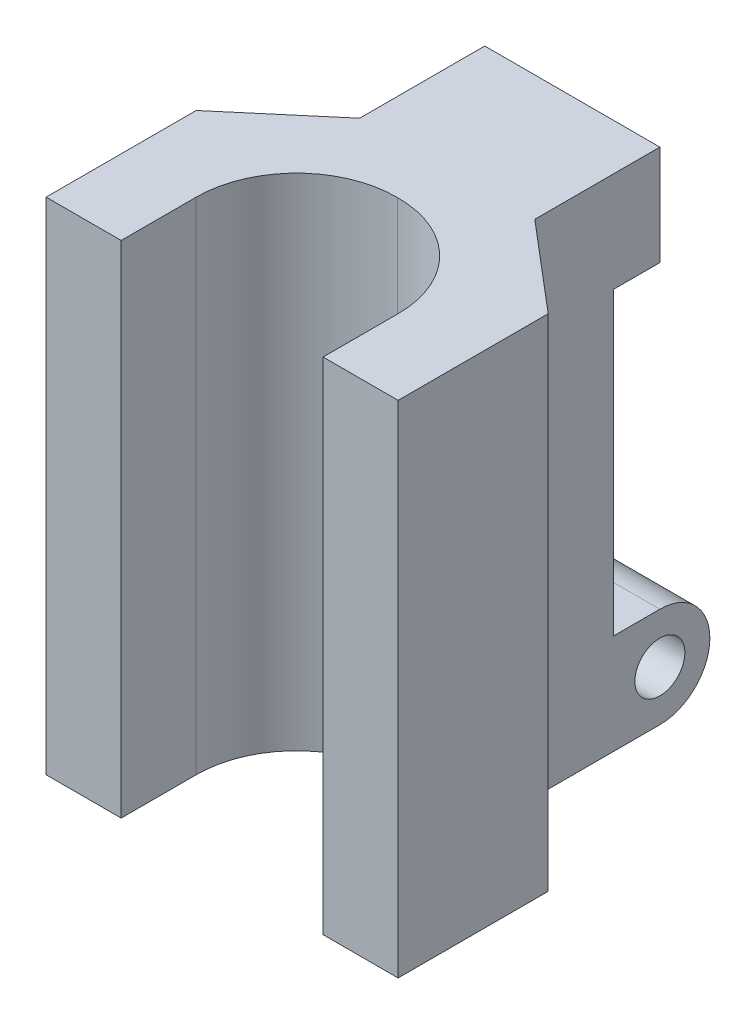
ISO-10303-21;
HEADER;
FILE_DESCRIPTION(('STEP AP214'),'2;1');
FILE_NAME('part.step','',(''),(''),'','','');
FILE_SCHEMA(('AUTOMOTIVE_DESIGN { 1 0 10303 214 1 1 1 1 }'));
ENDSEC;
DATA;
#1=APPLICATION_CONTEXT('core data for automotive mechanical design processes');
#2=APPLICATION_PROTOCOL_DEFINITION('international standard','automotive_design',2000,#1);
#3=PRODUCT_CONTEXT('',#1,'mechanical');
#4=PRODUCT('Part','Part','',(#3));
#5=PRODUCT_RELATED_PRODUCT_CATEGORY('part','',(#4));
#6=PRODUCT_DEFINITION_FORMATION('','',#4);
#7=PRODUCT_DEFINITION_CONTEXT('part definition',#1,'design');
#8=PRODUCT_DEFINITION('design','',#6,#7);
#9=PRODUCT_DEFINITION_SHAPE('','',#8);
#10=(LENGTH_UNIT() NAMED_UNIT(*) SI_UNIT(.MILLI.,.METRE.));
#11=(NAMED_UNIT(*) PLANE_ANGLE_UNIT() SI_UNIT($,.RADIAN.));
#12=(NAMED_UNIT(*) SI_UNIT($,.STERADIAN.) SOLID_ANGLE_UNIT());
#13=UNCERTAINTY_MEASURE_WITH_UNIT(LENGTH_MEASURE(1.E-05),#10,'distance_accuracy_value','');
#14=(GEOMETRIC_REPRESENTATION_CONTEXT(3) GLOBAL_UNCERTAINTY_ASSIGNED_CONTEXT((#13)) GLOBAL_UNIT_ASSIGNED_CONTEXT((#10,
#11,#12)) REPRESENTATION_CONTEXT('',''));
#15=CARTESIAN_POINT('',(0.,0.,0.));
#16=DIRECTION('',(0.,0.,1.));
#17=DIRECTION('',(1.,0.,0.));
#18=AXIS2_PLACEMENT_3D('',#15,#16,#17);
#19=CARTESIAN_POINT('',(0.,0.,0.));
#20=DIRECTION('',(0.,1.,0.));
#21=DIRECTION('',(0.,0.,1.));
#22=AXIS2_PLACEMENT_3D('',#19,#20,#21);
#23=PLANE('',#22);
#24=CARTESIAN_POINT('',(0.226816500569542,0.,38.0561546430867));
#25=DIRECTION('',(0.,1.,0.));
#26=DIRECTION('',(0.,0.,1.));
#27=AXIS2_PLACEMENT_3D('',#24,#25,#26);
#28=CIRCLE('',#27,25.4);
#29=CARTESIAN_POINT('',(25.62677865772,0.,38.1));
#30=VERTEX_POINT('',#29);
#31=CARTESIAN_POINT('',(0.,0.,12.6571673743969));
#32=VERTEX_POINT('',#31);
#33=EDGE_CURVE('E221',#30,#32,#28,.T.);
#34=ORIENTED_EDGE('',*,*,#33,.F.);
#35=DIRECTION('',(0.,0.,-1.));
#36=VECTOR('',#35,1.);
#37=CARTESIAN_POINT('',(25.62677865772,0.,0.));
#38=LINE('',#37,#36);
#39=CARTESIAN_POINT('',(25.62677865772,0.,57.15));
#40=VERTEX_POINT('',#39);
#41=EDGE_CURVE('E223',#40,#30,#38,.T.);
#42=ORIENTED_EDGE('',*,*,#41,.F.);
#43=DIRECTION('',(-1.,0.,0.));
#44=VECTOR('',#43,1.);
#45=CARTESIAN_POINT('',(0.,0.,57.15));
#46=LINE('',#45,#44);
#47=CARTESIAN_POINT('',(44.67677865772,0.,57.15));
#48=VERTEX_POINT('',#47);
#49=EDGE_CURVE('E226',#48,#40,#46,.T.);
#50=ORIENTED_EDGE('',*,*,#49,.F.);
#51=DIRECTION('',(0.,0.,1.));
#52=VECTOR('',#51,1.);
#53=CARTESIAN_POINT('',(44.67677865772,0.,0.));
#54=LINE('',#53,#52);
#55=CARTESIAN_POINT('',(44.67677865772,0.,19.05));
#56=VERTEX_POINT('',#55);
#57=EDGE_CURVE('E228',#56,#48,#54,.T.);
#58=ORIENTED_EDGE('',*,*,#57,.F.);
#59=DIRECTION('',(0.762509035057774,0.,0.646977566423491));
#60=VECTOR('',#59,1.);
#61=CARTESIAN_POINT('',(9.30293986559321,0.,-10.9641756812797));
#62=LINE('',#61,#60);
#63=CARTESIAN_POINT('',(22.225,0.,0.));
#64=VERTEX_POINT('',#63);
#65=EDGE_CURVE('E230',#64,#56,#62,.T.);
#66=ORIENTED_EDGE('',*,*,#65,.F.);
#67=DIRECTION('',(0.,0.,-1.));
#68=VECTOR('',#67,1.);
#69=CARTESIAN_POINT('',(22.225,0.,-31.75));
#70=LINE('',#69,#68);
#71=CARTESIAN_POINT('',(22.225,0.,-31.75));
#72=VERTEX_POINT('',#71);
#73=EDGE_CURVE('E332',#64,#72,#70,.T.);
#74=ORIENTED_EDGE('',*,*,#73,.T.);
#75=DIRECTION('',(-1.,0.,0.));
#76=VECTOR('',#75,1.);
#77=CARTESIAN_POINT('',(22.225,0.,-31.75));
#78=LINE('',#77,#76);
#79=CARTESIAN_POINT('',(-22.225,0.,-31.75));
#80=VERTEX_POINT('',#79);
#81=EDGE_CURVE('E354',#72,#80,#78,.T.);
#82=ORIENTED_EDGE('',*,*,#81,.T.);
#83=DIRECTION('',(0.,0.,-1.));
#84=VECTOR('',#83,1.);
#85=CARTESIAN_POINT('',(-22.225,0.,-31.75));
#86=LINE('',#85,#84);
#87=CARTESIAN_POINT('',(-22.225,0.,0.));
#88=VERTEX_POINT('',#87);
#89=EDGE_CURVE('E329',#88,#80,#86,.T.);
#90=ORIENTED_EDGE('',*,*,#89,.F.);
#91=DIRECTION('',(-0.762509035057774,0.,0.646977566423491));
#92=VECTOR('',#91,1.);
#93=CARTESIAN_POINT('',(-9.30293986559322,0.,-10.9641756812797));
#94=LINE('',#93,#92);
#95=CARTESIAN_POINT('',(-44.67677865772,0.,19.05));
#96=VERTEX_POINT('',#95);
#97=EDGE_CURVE('E232',#88,#96,#94,.T.);
#98=ORIENTED_EDGE('',*,*,#97,.T.);
#99=DIRECTION('',(0.,0.,1.));
#100=VECTOR('',#99,1.);
#101=CARTESIAN_POINT('',(-44.67677865772,0.,0.));
#102=LINE('',#101,#100);
#103=CARTESIAN_POINT('',(-44.67677865772,0.,57.15));
#104=VERTEX_POINT('',#103);
#105=EDGE_CURVE('E235',#96,#104,#102,.T.);
#106=ORIENTED_EDGE('',*,*,#105,.T.);
#107=DIRECTION('',(1.,0.,0.));
#108=VECTOR('',#107,1.);
#109=CARTESIAN_POINT('',(0.,0.,57.15));
#110=LINE('',#109,#108);
#111=CARTESIAN_POINT('',(-25.62677865772,0.,57.15));
#112=VERTEX_POINT('',#111);
#113=EDGE_CURVE('E238',#104,#112,#110,.T.);
#114=ORIENTED_EDGE('',*,*,#113,.T.);
#115=DIRECTION('',(0.,0.,-1.));
#116=VECTOR('',#115,1.);
#117=CARTESIAN_POINT('',(-25.62677865772,0.,0.));
#118=LINE('',#117,#116);
#119=CARTESIAN_POINT('',(-25.62677865772,0.,38.1));
#120=VERTEX_POINT('',#119);
#121=EDGE_CURVE('E199',#112,#120,#118,.T.);
#122=ORIENTED_EDGE('',*,*,#121,.T.);
#123=CARTESIAN_POINT('',(-0.226816500569542,0.,38.0561546430867));
#124=DIRECTION('',(0.,1.,0.));
#125=DIRECTION('',(0.,0.,1.));
#126=AXIS2_PLACEMENT_3D('',#123,#124,#125);
#127=CIRCLE('',#126,25.4);
#128=EDGE_CURVE('E241',#120,#32,#127,.F.);
#129=ORIENTED_EDGE('',*,*,#128,.T.);
#130=EDGE_LOOP('',(#34,#42,#50,#58,#66,#74,#82,#90,#98,#106,#114,#122,#129));
#131=FACE_BOUND('',#130,.T.);
#132=ADVANCED_FACE('F105',(#131),#23,.T.);
#133=CARTESIAN_POINT('',(0.226816500569542,-127.,38.0561546430867));
#134=DIRECTION('',(0.,1.,0.));
#135=DIRECTION('',(0.,0.,1.));
#136=AXIS2_PLACEMENT_3D('',#133,#134,#135);
#137=CYLINDRICAL_SURFACE('',#136,25.4);
#138=ORIENTED_EDGE('',*,*,#33,.T.);
#139=DIRECTION('',(0.,1.,0.));
#140=VECTOR('',#139,1.);
#141=CARTESIAN_POINT('',(0.,-127.,12.6571673743969));
#142=LINE('',#141,#140);
#143=CARTESIAN_POINT('',(0.,-127.,12.6571673743969));
#144=VERTEX_POINT('',#143);
#145=EDGE_CURVE('E12',#144,#32,#142,.T.);
#146=ORIENTED_EDGE('',*,*,#145,.F.);
#147=CARTESIAN_POINT('',(0.226816500569542,-127.,38.0561546430867));
#148=DIRECTION('',(0.,1.,0.));
#149=DIRECTION('',(0.,0.,1.));
#150=AXIS2_PLACEMENT_3D('',#147,#148,#149);
#151=CIRCLE('',#150,25.4);
#152=CARTESIAN_POINT('',(25.62677865772,-127.,38.1));
#153=VERTEX_POINT('',#152);
#154=EDGE_CURVE('E124',#153,#144,#151,.T.);
#155=ORIENTED_EDGE('',*,*,#154,.F.);
#156=DIRECTION('',(0.,1.,0.));
#157=VECTOR('',#156,1.);
#158=CARTESIAN_POINT('',(25.62677865772,-127.,38.1));
#159=LINE('',#158,#157);
#160=EDGE_CURVE('E109',#153,#30,#159,.T.);
#161=ORIENTED_EDGE('',*,*,#160,.T.);
#162=EDGE_LOOP('',(#138,#146,#155,#161));
#163=FACE_BOUND('',#162,.T.);
#164=ADVANCED_FACE('F107',(#163),#137,.F.);
#165=CARTESIAN_POINT('',(25.62677865772,-127.,0.));
#166=DIRECTION('',(1.,0.,0.));
#167=DIRECTION('',(0.,0.,-1.));
#168=AXIS2_PLACEMENT_3D('',#165,#166,#167);
#169=PLANE('',#168);
#170=ORIENTED_EDGE('',*,*,#41,.T.);
#171=ORIENTED_EDGE('',*,*,#160,.F.);
#172=DIRECTION('',(0.,0.,-1.));
#173=VECTOR('',#172,1.);
#174=CARTESIAN_POINT('',(25.62677865772,-127.,0.));
#175=LINE('',#174,#173);
#176=CARTESIAN_POINT('',(25.62677865772,-127.,57.15));
#177=VERTEX_POINT('',#176);
#178=EDGE_CURVE('E170',#177,#153,#175,.T.);
#179=ORIENTED_EDGE('',*,*,#178,.F.);
#180=DIRECTION('',(0.,1.,0.));
#181=VECTOR('',#180,1.);
#182=CARTESIAN_POINT('',(25.62677865772,-127.,57.15));
#183=LINE('',#182,#181);
#184=EDGE_CURVE('E258',#177,#40,#183,.T.);
#185=ORIENTED_EDGE('',*,*,#184,.T.);
#186=EDGE_LOOP('',(#170,#171,#179,#185));
#187=FACE_BOUND('',#186,.T.);
#188=ADVANCED_FACE('F280',(#187),#169,.F.);
#189=CARTESIAN_POINT('',(0.,-127.,57.15));
#190=DIRECTION('',(0.,0.,-1.));
#191=DIRECTION('',(-1.,0.,0.));
#192=AXIS2_PLACEMENT_3D('',#189,#190,#191);
#193=PLANE('',#192);
#194=ORIENTED_EDGE('',*,*,#49,.T.);
#195=ORIENTED_EDGE('',*,*,#184,.F.);
#196=DIRECTION('',(-1.,0.,0.));
#197=VECTOR('',#196,1.);
#198=CARTESIAN_POINT('',(0.,-127.,57.15));
#199=LINE('',#198,#197);
#200=CARTESIAN_POINT('',(44.67677865772,-127.,57.15));
#201=VERTEX_POINT('',#200);
#202=EDGE_CURVE('E392',#201,#177,#199,.T.);
#203=ORIENTED_EDGE('',*,*,#202,.F.);
#204=DIRECTION('',(0.,1.,0.));
#205=VECTOR('',#204,1.);
#206=CARTESIAN_POINT('',(44.67677865772,-127.,57.15));
#207=LINE('',#206,#205);
#208=EDGE_CURVE('E256',#201,#48,#207,.T.);
#209=ORIENTED_EDGE('',*,*,#208,.T.);
#210=EDGE_LOOP('',(#194,#195,#203,#209));
#211=FACE_BOUND('',#210,.T.);
#212=ADVANCED_FACE('F285',(#211),#193,.F.);
#213=CARTESIAN_POINT('',(44.67677865772,-127.,0.));
#214=DIRECTION('',(-1.,0.,0.));
#215=DIRECTION('',(0.,0.,1.));
#216=AXIS2_PLACEMENT_3D('',#213,#214,#215);
#217=PLANE('',#216);
#218=ORIENTED_EDGE('',*,*,#57,.T.);
#219=ORIENTED_EDGE('',*,*,#208,.F.);
#220=DIRECTION('',(0.,0.,1.));
#221=VECTOR('',#220,1.);
#222=CARTESIAN_POINT('',(44.67677865772,-127.,0.));
#223=LINE('',#222,#221);
#224=CARTESIAN_POINT('',(44.67677865772,-127.,19.05));
#225=VERTEX_POINT('',#224);
#226=EDGE_CURVE('E394',#225,#201,#223,.T.);
#227=ORIENTED_EDGE('',*,*,#226,.F.);
#228=DIRECTION('',(0.,1.,0.));
#229=VECTOR('',#228,1.);
#230=CARTESIAN_POINT('',(44.67677865772,-127.,19.05));
#231=LINE('',#230,#229);
#232=EDGE_CURVE('E253',#225,#56,#231,.T.);
#233=ORIENTED_EDGE('',*,*,#232,.T.);
#234=EDGE_LOOP('',(#218,#219,#227,#233));
#235=FACE_BOUND('',#234,.T.);
#236=ADVANCED_FACE('F451',(#235),#217,.F.);
#237=CARTESIAN_POINT('',(9.30293986559321,-127.,-10.9641756812797));
#238=DIRECTION('',(-0.646977566423491,0.,0.762509035057774));
#239=DIRECTION('',(0.762509035057774,0.,0.646977566423491));
#240=AXIS2_PLACEMENT_3D('',#237,#238,#239);
#241=PLANE('',#240);
#242=ORIENTED_EDGE('',*,*,#65,.T.);
#243=ORIENTED_EDGE('',*,*,#232,.F.);
#244=DIRECTION('',(0.762509035057774,0.,0.646977566423491));
#245=VECTOR('',#244,1.);
#246=CARTESIAN_POINT('',(9.30293986559321,-127.,-10.9641756812797));
#247=LINE('',#246,#245);
#248=CARTESIAN_POINT('',(22.225,-127.,0.));
#249=VERTEX_POINT('',#248);
#250=EDGE_CURVE('E396',#249,#225,#247,.T.);
#251=ORIENTED_EDGE('',*,*,#250,.F.);
#252=DIRECTION('',(0.,1.,0.));
#253=VECTOR('',#252,1.);
#254=CARTESIAN_POINT('',(22.225,-127.,0.));
#255=LINE('',#254,#253);
#256=EDGE_CURVE('E251',#249,#64,#255,.T.);
#257=ORIENTED_EDGE('',*,*,#256,.T.);
#258=EDGE_LOOP('',(#242,#243,#251,#257));
#259=FACE_BOUND('',#258,.T.);
#260=ADVANCED_FACE('F448',(#259),#241,.F.);
#261=CARTESIAN_POINT('',(-9.30293986559322,-127.,-10.9641756812797));
#262=DIRECTION('',(-0.646977566423491,0.,-0.762509035057774));
#263=DIRECTION('',(-0.762509035057774,0.,0.646977566423491));
#264=AXIS2_PLACEMENT_3D('',#261,#262,#263);
#265=PLANE('',#264);
#266=ORIENTED_EDGE('',*,*,#97,.F.);
#267=DIRECTION('',(0.,1.,0.));
#268=VECTOR('',#267,1.);
#269=CARTESIAN_POINT('',(-22.225,-127.,0.));
#270=LINE('',#269,#268);
#271=CARTESIAN_POINT('',(-22.225,-127.,0.));
#272=VERTEX_POINT('',#271);
#273=EDGE_CURVE('E248',#272,#88,#270,.T.);
#274=ORIENTED_EDGE('',*,*,#273,.F.);
#275=DIRECTION('',(-0.762509035057774,0.,0.646977566423491));
#276=VECTOR('',#275,1.);
#277=CARTESIAN_POINT('',(-9.30293986559322,-127.,-10.9641756812797));
#278=LINE('',#277,#276);
#279=CARTESIAN_POINT('',(-44.67677865772,-127.,19.05));
#280=VERTEX_POINT('',#279);
#281=EDGE_CURVE('E216',#272,#280,#278,.T.);
#282=ORIENTED_EDGE('',*,*,#281,.T.);
#283=DIRECTION('',(0.,1.,0.));
#284=VECTOR('',#283,1.);
#285=CARTESIAN_POINT('',(-44.67677865772,-127.,19.05));
#286=LINE('',#285,#284);
#287=EDGE_CURVE('E246',#280,#96,#286,.T.);
#288=ORIENTED_EDGE('',*,*,#287,.T.);
#289=EDGE_LOOP('',(#266,#274,#282,#288));
#290=FACE_BOUND('',#289,.T.);
#291=ADVANCED_FACE('F401',(#290),#265,.T.);
#292=CARTESIAN_POINT('',(-44.67677865772,-127.,0.));
#293=DIRECTION('',(-1.,0.,0.));
#294=DIRECTION('',(0.,0.,1.));
#295=AXIS2_PLACEMENT_3D('',#292,#293,#294);
#296=PLANE('',#295);
#297=ORIENTED_EDGE('',*,*,#105,.F.);
#298=ORIENTED_EDGE('',*,*,#287,.F.);
#299=DIRECTION('',(0.,0.,1.));
#300=VECTOR('',#299,1.);
#301=CARTESIAN_POINT('',(-44.67677865772,-127.,0.));
#302=LINE('',#301,#300);
#303=CARTESIAN_POINT('',(-44.67677865772,-127.,57.15));
#304=VERTEX_POINT('',#303);
#305=EDGE_CURVE('E214',#280,#304,#302,.T.);
#306=ORIENTED_EDGE('',*,*,#305,.T.);
#307=DIRECTION('',(0.,1.,0.));
#308=VECTOR('',#307,1.);
#309=CARTESIAN_POINT('',(-44.67677865772,-127.,57.15));
#310=LINE('',#309,#308);
#311=EDGE_CURVE('E204',#304,#104,#310,.T.);
#312=ORIENTED_EDGE('',*,*,#311,.T.);
#313=EDGE_LOOP('',(#297,#298,#306,#312));
#314=FACE_BOUND('',#313,.T.);
#315=ADVANCED_FACE('F459',(#314),#296,.T.);
#316=CARTESIAN_POINT('',(0.,-127.,57.15));
#317=DIRECTION('',(0.,0.,1.));
#318=DIRECTION('',(1.,0.,0.));
#319=AXIS2_PLACEMENT_3D('',#316,#317,#318);
#320=PLANE('',#319);
#321=ORIENTED_EDGE('',*,*,#113,.F.);
#322=ORIENTED_EDGE('',*,*,#311,.F.);
#323=DIRECTION('',(1.,0.,0.));
#324=VECTOR('',#323,1.);
#325=CARTESIAN_POINT('',(0.,-127.,57.15));
#326=LINE('',#325,#324);
#327=CARTESIAN_POINT('',(-25.62677865772,-127.,57.15));
#328=VERTEX_POINT('',#327);
#329=EDGE_CURVE('E209',#304,#328,#326,.T.);
#330=ORIENTED_EDGE('',*,*,#329,.T.);
#331=DIRECTION('',(0.,1.,0.));
#332=VECTOR('',#331,1.);
#333=CARTESIAN_POINT('',(-25.62677865772,-127.,57.15));
#334=LINE('',#333,#332);
#335=EDGE_CURVE('E195',#328,#112,#334,.T.);
#336=ORIENTED_EDGE('',*,*,#335,.T.);
#337=EDGE_LOOP('',(#321,#322,#330,#336));
#338=FACE_BOUND('',#337,.T.);
#339=ADVANCED_FACE('F213',(#338),#320,.T.);
#340=CARTESIAN_POINT('',(-25.62677865772,-127.,0.));
#341=DIRECTION('',(1.,0.,0.));
#342=DIRECTION('',(0.,0.,-1.));
#343=AXIS2_PLACEMENT_3D('',#340,#341,#342);
#344=PLANE('',#343);
#345=ORIENTED_EDGE('',*,*,#121,.F.);
#346=ORIENTED_EDGE('',*,*,#335,.F.);
#347=DIRECTION('',(0.,0.,-1.));
#348=VECTOR('',#347,1.);
#349=CARTESIAN_POINT('',(-25.62677865772,-127.,0.));
#350=LINE('',#349,#348);
#351=CARTESIAN_POINT('',(-25.62677865772,-127.,38.1));
#352=VERTEX_POINT('',#351);
#353=EDGE_CURVE('E198',#328,#352,#350,.T.);
#354=ORIENTED_EDGE('',*,*,#353,.T.);
#355=DIRECTION('',(0.,1.,0.));
#356=VECTOR('',#355,1.);
#357=CARTESIAN_POINT('',(-25.62677865772,-127.,38.1));
#358=LINE('',#357,#356);
#359=EDGE_CURVE('E115',#352,#120,#358,.T.);
#360=ORIENTED_EDGE('',*,*,#359,.T.);
#361=EDGE_LOOP('',(#345,#346,#354,#360));
#362=FACE_BOUND('',#361,.T.);
#363=ADVANCED_FACE('F197',(#362),#344,.T.);
#364=CARTESIAN_POINT('',(-0.226816500569542,-127.,38.0561546430867));
#365=DIRECTION('',(0.,1.,0.));
#366=DIRECTION('',(0.,0.,1.));
#367=AXIS2_PLACEMENT_3D('',#364,#365,#366);
#368=CYLINDRICAL_SURFACE('',#367,25.4);
#369=ORIENTED_EDGE('',*,*,#128,.F.);
#370=ORIENTED_EDGE('',*,*,#359,.F.);
#371=CARTESIAN_POINT('',(-0.226816500569542,-127.,38.0561546430867));
#372=DIRECTION('',(0.,1.,0.));
#373=DIRECTION('',(0.,0.,1.));
#374=AXIS2_PLACEMENT_3D('',#371,#372,#373);
#375=CIRCLE('',#374,25.4);
#376=EDGE_CURVE('E211',#352,#144,#375,.F.);
#377=ORIENTED_EDGE('',*,*,#376,.T.);
#378=ORIENTED_EDGE('',*,*,#145,.T.);
#379=EDGE_LOOP('',(#369,#370,#377,#378));
#380=FACE_BOUND('',#379,.T.);
#381=ADVANCED_FACE('F268',(#380),#368,.F.);
#382=CARTESIAN_POINT('',(0.,-127.,0.));
#383=DIRECTION('',(0.,1.,0.));
#384=DIRECTION('',(0.,0.,1.));
#385=AXIS2_PLACEMENT_3D('',#382,#383,#384);
#386=PLANE('',#385);
#387=ORIENTED_EDGE('',*,*,#154,.T.);
#388=ORIENTED_EDGE('',*,*,#376,.F.);
#389=ORIENTED_EDGE('',*,*,#353,.F.);
#390=ORIENTED_EDGE('',*,*,#329,.F.);
#391=ORIENTED_EDGE('',*,*,#305,.F.);
#392=ORIENTED_EDGE('',*,*,#281,.F.);
#393=DIRECTION('',(0.,0.,1.));
#394=VECTOR('',#393,1.);
#395=CARTESIAN_POINT('',(-22.225,-127.,0.));
#396=LINE('',#395,#394);
#397=CARTESIAN_POINT('',(-22.225,-127.,-31.75));
#398=VERTEX_POINT('',#397);
#399=EDGE_CURVE('E336',#398,#272,#396,.T.);
#400=ORIENTED_EDGE('',*,*,#399,.F.);
#401=DIRECTION('',(-1.,0.,0.));
#402=VECTOR('',#401,1.);
#403=CARTESIAN_POINT('',(22.225,-127.,-31.75));
#404=LINE('',#403,#402);
#405=CARTESIAN_POINT('',(22.225,-127.,-31.75));
#406=VERTEX_POINT('',#405);
#407=EDGE_CURVE('E224',#406,#398,#404,.T.);
#408=ORIENTED_EDGE('',*,*,#407,.F.);
#409=DIRECTION('',(0.,0.,1.));
#410=VECTOR('',#409,1.);
#411=CARTESIAN_POINT('',(22.225,-127.,0.));
#412=LINE('',#411,#410);
#413=EDGE_CURVE('E351',#406,#249,#412,.T.);
#414=ORIENTED_EDGE('',*,*,#413,.T.);
#415=ORIENTED_EDGE('',*,*,#250,.T.);
#416=ORIENTED_EDGE('',*,*,#226,.T.);
#417=ORIENTED_EDGE('',*,*,#202,.T.);
#418=ORIENTED_EDGE('',*,*,#178,.T.);
#419=EDGE_LOOP('',(#387,#388,#389,#390,#391,#392,#400,#408,#414,#415,#416,#417,#418));
#420=FACE_BOUND('',#419,.T.);
#421=ADVANCED_FACE('F207',(#420),#386,.F.);
#422=CARTESIAN_POINT('',(22.225,-114.3,-31.75));
#423=DIRECTION('',(-1.,0.,0.));
#424=DIRECTION('',(0.,0.,1.));
#425=AXIS2_PLACEMENT_3D('',#422,#423,#424);
#426=CYLINDRICAL_SURFACE('',#425,12.7);
#427=CARTESIAN_POINT('',(-22.225,-114.3,-31.75));
#428=DIRECTION('',(-1.,0.,0.));
#429=DIRECTION('',(0.,0.,-1.));
#430=AXIS2_PLACEMENT_3D('',#427,#428,#429);
#431=CIRCLE('',#430,12.7);
#432=CARTESIAN_POINT('',(-22.225,-101.6,-31.75));
#433=VERTEX_POINT('',#432);
#434=EDGE_CURVE('E369',#433,#398,#431,.T.);
#435=ORIENTED_EDGE('',*,*,#434,.F.);
#436=DIRECTION('',(-1.,0.,0.));
#437=VECTOR('',#436,1.);
#438=CARTESIAN_POINT('',(22.225,-101.6,-31.75));
#439=LINE('',#438,#437);
#440=CARTESIAN_POINT('',(22.225,-101.6,-31.75));
#441=VERTEX_POINT('',#440);
#442=EDGE_CURVE('E376',#441,#433,#439,.T.);
#443=ORIENTED_EDGE('',*,*,#442,.F.);
#444=CARTESIAN_POINT('',(22.225,-114.3,-31.75));
#445=DIRECTION('',(-1.,0.,0.));
#446=DIRECTION('',(0.,0.,-1.));
#447=AXIS2_PLACEMENT_3D('',#444,#445,#446);
#448=CIRCLE('',#447,12.7);
#449=EDGE_CURVE('E348',#441,#406,#448,.T.);
#450=ORIENTED_EDGE('',*,*,#449,.T.);
#451=ORIENTED_EDGE('',*,*,#407,.T.);
#452=EDGE_LOOP('',(#435,#443,#450,#451));
#453=FACE_BOUND('',#452,.T.);
#454=ADVANCED_FACE('F275',(#453),#426,.T.);
#455=CARTESIAN_POINT('',(22.225,-101.6,-31.75));
#456=DIRECTION('',(0.,1.,0.));
#457=DIRECTION('',(0.,0.,1.));
#458=AXIS2_PLACEMENT_3D('',#455,#456,#457);
#459=PLANE('',#458);
#460=DIRECTION('',(0.,0.,-1.));
#461=VECTOR('',#460,1.);
#462=CARTESIAN_POINT('',(-22.225,-101.6,-31.75));
#463=LINE('',#462,#461);
#464=CARTESIAN_POINT('',(-22.225,-101.6,-20.0061736202035));
#465=VERTEX_POINT('',#464);
#466=EDGE_CURVE('E366',#465,#433,#463,.T.);
#467=ORIENTED_EDGE('',*,*,#466,.F.);
#468=DIRECTION('',(-1.,0.,0.));
#469=VECTOR('',#468,1.);
#470=CARTESIAN_POINT('',(22.225,-101.6,-20.0061736202035));
#471=LINE('',#470,#469);
#472=CARTESIAN_POINT('',(22.225,-101.6,-20.0061736202035));
#473=VERTEX_POINT('',#472);
#474=EDGE_CURVE('E379',#473,#465,#471,.T.);
#475=ORIENTED_EDGE('',*,*,#474,.F.);
#476=DIRECTION('',(0.,0.,-1.));
#477=VECTOR('',#476,1.);
#478=CARTESIAN_POINT('',(22.225,-101.6,-31.75));
#479=LINE('',#478,#477);
#480=EDGE_CURVE('E345',#473,#441,#479,.T.);
#481=ORIENTED_EDGE('',*,*,#480,.T.);
#482=ORIENTED_EDGE('',*,*,#442,.T.);
#483=EDGE_LOOP('',(#467,#475,#481,#482));
#484=FACE_BOUND('',#483,.T.);
#485=ADVANCED_FACE('F301',(#484),#459,.T.);
#486=CARTESIAN_POINT('',(22.225,-101.6,-20.0061736202035));
#487=DIRECTION('',(0.,0.,-1.));
#488=DIRECTION('',(-1.,0.,0.));
#489=AXIS2_PLACEMENT_3D('',#486,#487,#488);
#490=PLANE('',#489);
#491=DIRECTION('',(0.,-1.,0.));
#492=VECTOR('',#491,1.);
#493=CARTESIAN_POINT('',(-22.225,-101.6,-20.0061736202035));
#494=LINE('',#493,#492);
#495=CARTESIAN_POINT('',(-22.225,-25.4,-20.0061736202035));
#496=VERTEX_POINT('',#495);
#497=EDGE_CURVE('E363',#496,#465,#494,.T.);
#498=ORIENTED_EDGE('',*,*,#497,.F.);
#499=DIRECTION('',(-1.,0.,0.));
#500=VECTOR('',#499,1.);
#501=CARTESIAN_POINT('',(22.225,-25.4,-20.0061736202035));
#502=LINE('',#501,#500);
#503=CARTESIAN_POINT('',(22.225,-25.4,-20.0061736202035));
#504=VERTEX_POINT('',#503);
#505=EDGE_CURVE('E382',#504,#496,#502,.T.);
#506=ORIENTED_EDGE('',*,*,#505,.F.);
#507=DIRECTION('',(0.,-1.,0.));
#508=VECTOR('',#507,1.);
#509=CARTESIAN_POINT('',(22.225,-101.6,-20.0061736202035));
#510=LINE('',#509,#508);
#511=EDGE_CURVE('E342',#504,#473,#510,.T.);
#512=ORIENTED_EDGE('',*,*,#511,.T.);
#513=ORIENTED_EDGE('',*,*,#474,.T.);
#514=EDGE_LOOP('',(#498,#506,#512,#513));
#515=FACE_BOUND('',#514,.T.);
#516=ADVANCED_FACE('F297',(#515),#490,.T.);
#517=CARTESIAN_POINT('',(22.225,-25.4,-20.0061736202035));
#518=DIRECTION('',(0.,-1.,0.));
#519=DIRECTION('',(0.,0.,-1.));
#520=AXIS2_PLACEMENT_3D('',#517,#518,#519);
#521=PLANE('',#520);
#522=DIRECTION('',(0.,0.,1.));
#523=VECTOR('',#522,1.);
#524=CARTESIAN_POINT('',(-22.225,-25.4,-20.0061736202035));
#525=LINE('',#524,#523);
#526=CARTESIAN_POINT('',(-22.225,-25.4,-31.75));
#527=VERTEX_POINT('',#526);
#528=EDGE_CURVE('E360',#527,#496,#525,.T.);
#529=ORIENTED_EDGE('',*,*,#528,.F.);
#530=DIRECTION('',(-1.,0.,0.));
#531=VECTOR('',#530,1.);
#532=CARTESIAN_POINT('',(22.225,-25.4,-31.75));
#533=LINE('',#532,#531);
#534=CARTESIAN_POINT('',(22.225,-25.4,-31.75));
#535=VERTEX_POINT('',#534);
#536=EDGE_CURVE('E385',#535,#527,#533,.T.);
#537=ORIENTED_EDGE('',*,*,#536,.F.);
#538=DIRECTION('',(0.,0.,1.));
#539=VECTOR('',#538,1.);
#540=CARTESIAN_POINT('',(22.225,-25.4,-20.0061736202035));
#541=LINE('',#540,#539);
#542=EDGE_CURVE('E339',#535,#504,#541,.T.);
#543=ORIENTED_EDGE('',*,*,#542,.T.);
#544=ORIENTED_EDGE('',*,*,#505,.T.);
#545=EDGE_LOOP('',(#529,#537,#543,#544));
#546=FACE_BOUND('',#545,.T.);
#547=ADVANCED_FACE('F293',(#546),#521,.T.);
#548=CARTESIAN_POINT('',(22.225,-25.4,-31.75));
#549=DIRECTION('',(0.,0.,-1.));
#550=DIRECTION('',(-1.,0.,0.));
#551=AXIS2_PLACEMENT_3D('',#548,#549,#550);
#552=PLANE('',#551);
#553=DIRECTION('',(0.,-1.,0.));
#554=VECTOR('',#553,1.);
#555=CARTESIAN_POINT('',(-22.225,-25.4,-31.75));
#556=LINE('',#555,#554);
#557=EDGE_CURVE('E357',#80,#527,#556,.T.);
#558=ORIENTED_EDGE('',*,*,#557,.F.);
#559=ORIENTED_EDGE('',*,*,#81,.F.);
#560=DIRECTION('',(0.,-1.,0.));
#561=VECTOR('',#560,1.);
#562=CARTESIAN_POINT('',(22.225,-25.4,-31.75));
#563=LINE('',#562,#561);
#564=EDGE_CURVE('E335',#72,#535,#563,.T.);
#565=ORIENTED_EDGE('',*,*,#564,.T.);
#566=ORIENTED_EDGE('',*,*,#536,.T.);
#567=EDGE_LOOP('',(#558,#559,#565,#566));
#568=FACE_BOUND('',#567,.T.);
#569=ADVANCED_FACE('F289',(#568),#552,.T.);
#570=CARTESIAN_POINT('',(22.225,-114.3,-31.75));
#571=DIRECTION('',(1.,0.,0.));
#572=DIRECTION('',(0.,0.,-1.));
#573=AXIS2_PLACEMENT_3D('',#570,#571,#572);
#574=PLANE('',#573);
#575=CARTESIAN_POINT('',(22.225,-114.3,-31.75));
#576=DIRECTION('',(-1.,0.,0.));
#577=DIRECTION('',(0.,0.,1.));
#578=AXIS2_PLACEMENT_3D('',#575,#576,#577);
#579=CIRCLE('',#578,6.35);
#580=CARTESIAN_POINT('',(22.225,-114.3,-25.4));
#581=VERTEX_POINT('',#580);
#582=EDGE_CURVE('E324',#581,#581,#579,.T.);
#583=ORIENTED_EDGE('',*,*,#582,.T.);
#584=EDGE_LOOP('',(#583));
#585=FACE_BOUND('',#584,.T.);
#586=ORIENTED_EDGE('',*,*,#256,.F.);
#587=ORIENTED_EDGE('',*,*,#413,.F.);
#588=ORIENTED_EDGE('',*,*,#449,.F.);
#589=ORIENTED_EDGE('',*,*,#480,.F.);
#590=ORIENTED_EDGE('',*,*,#511,.F.);
#591=ORIENTED_EDGE('',*,*,#542,.F.);
#592=ORIENTED_EDGE('',*,*,#564,.F.);
#593=ORIENTED_EDGE('',*,*,#73,.F.);
#594=EDGE_LOOP('',(#586,#587,#588,#589,#590,#591,#592,#593));
#595=FACE_BOUND('',#594,.T.);
#596=ADVANCED_FACE('F292',(#585,#595),#574,.T.);
#597=CARTESIAN_POINT('',(-22.225,-114.3,-31.75));
#598=DIRECTION('',(1.,0.,0.));
#599=DIRECTION('',(0.,0.,-1.));
#600=AXIS2_PLACEMENT_3D('',#597,#598,#599);
#601=PLANE('',#600);
#602=CARTESIAN_POINT('',(-22.225,-114.3,-31.75));
#603=DIRECTION('',(-1.,0.,0.));
#604=DIRECTION('',(0.,0.,1.));
#605=AXIS2_PLACEMENT_3D('',#602,#603,#604);
#606=CIRCLE('',#605,6.35);
#607=CARTESIAN_POINT('',(-22.225,-114.3,-25.4));
#608=VERTEX_POINT('',#607);
#609=EDGE_CURVE('E327',#608,#608,#606,.T.);
#610=ORIENTED_EDGE('',*,*,#609,.F.);
#611=EDGE_LOOP('',(#610));
#612=FACE_BOUND('',#611,.T.);
#613=ORIENTED_EDGE('',*,*,#273,.T.);
#614=ORIENTED_EDGE('',*,*,#89,.T.);
#615=ORIENTED_EDGE('',*,*,#557,.T.);
#616=ORIENTED_EDGE('',*,*,#528,.T.);
#617=ORIENTED_EDGE('',*,*,#497,.T.);
#618=ORIENTED_EDGE('',*,*,#466,.T.);
#619=ORIENTED_EDGE('',*,*,#434,.T.);
#620=ORIENTED_EDGE('',*,*,#399,.T.);
#621=EDGE_LOOP('',(#613,#614,#615,#616,#617,#618,#619,#620));
#622=FACE_BOUND('',#621,.T.);
#623=ADVANCED_FACE('F309',(#612,#622),#601,.F.);
#624=CARTESIAN_POINT('',(22.225,-114.3,-31.75));
#625=DIRECTION('',(-1.,0.,0.));
#626=DIRECTION('',(0.,0.,1.));
#627=AXIS2_PLACEMENT_3D('',#624,#625,#626);
#628=CYLINDRICAL_SURFACE('',#627,6.35);
#629=ORIENTED_EDGE('',*,*,#582,.F.);
#630=EDGE_LOOP('',(#629));
#631=FACE_BOUND('',#630,.T.);
#632=ORIENTED_EDGE('',*,*,#609,.T.);
#633=EDGE_LOOP('',(#632));
#634=FACE_BOUND('',#633,.T.);
#635=ADVANCED_FACE('F312',(#631,#634),#628,.F.);
#636=CLOSED_SHELL('',(#132,#164,#188,#212,#236,#260,#291,#315,#339,#363,#381,#421,#454,#485,
#516,#547,#569,#596,#623,#635));
#637=MANIFOLD_SOLID_BREP('B2',#636);
#638=ADVANCED_BREP_SHAPE_REPRESENTATION('',(#18,#637),#14);
#639=SHAPE_DEFINITION_REPRESENTATION(#9,#638);
ENDSEC;
END-ISO-10303-21;
